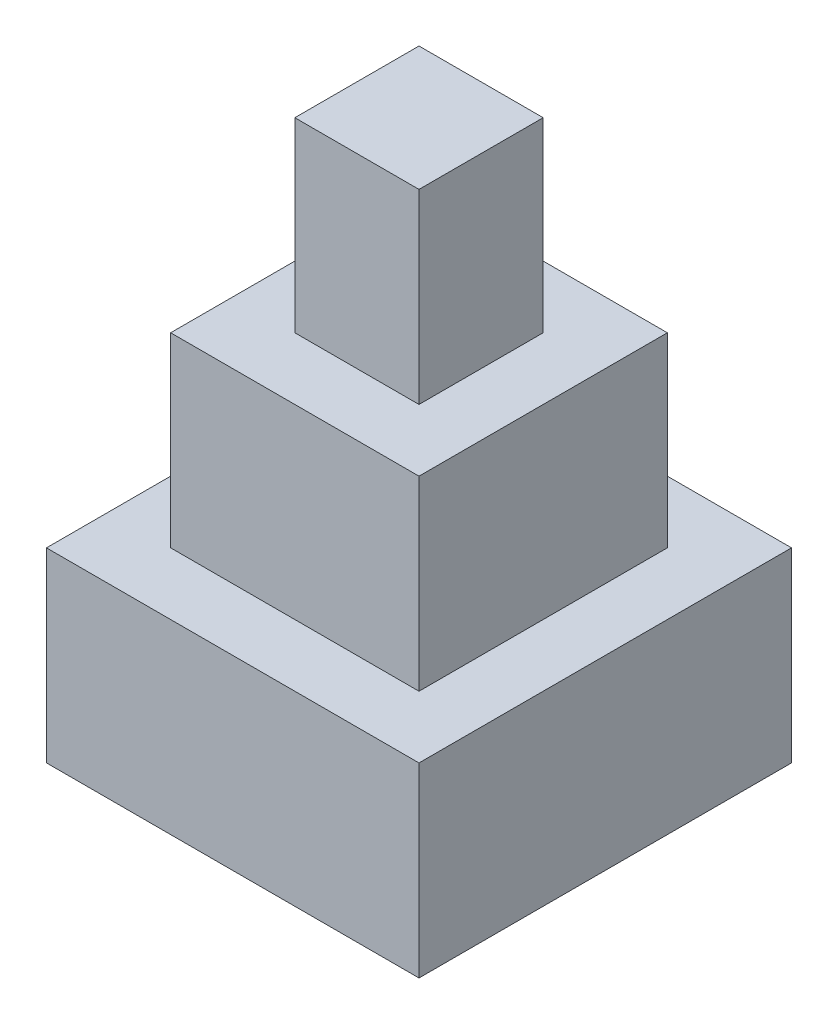
ISO-10303-21;
HEADER;
FILE_DESCRIPTION(('STEP AP214'),'2;1');
FILE_NAME('part.step','',(''),(''),'','','');
FILE_SCHEMA(('AUTOMOTIVE_DESIGN { 1 0 10303 214 1 1 1 1 }'));
ENDSEC;
DATA;
#1=APPLICATION_CONTEXT('core data for automotive mechanical design processes');
#2=APPLICATION_PROTOCOL_DEFINITION('international standard','automotive_design',2000,#1);
#3=PRODUCT_CONTEXT('',#1,'mechanical');
#4=PRODUCT('Part','Part','',(#3));
#5=PRODUCT_RELATED_PRODUCT_CATEGORY('part','',(#4));
#6=PRODUCT_DEFINITION_FORMATION('','',#4);
#7=PRODUCT_DEFINITION_CONTEXT('part definition',#1,'design');
#8=PRODUCT_DEFINITION('design','',#6,#7);
#9=PRODUCT_DEFINITION_SHAPE('','',#8);
#10=(LENGTH_UNIT() NAMED_UNIT(*) SI_UNIT(.MILLI.,.METRE.));
#11=(NAMED_UNIT(*) PLANE_ANGLE_UNIT() SI_UNIT($,.RADIAN.));
#12=(NAMED_UNIT(*) SI_UNIT($,.STERADIAN.) SOLID_ANGLE_UNIT());
#13=UNCERTAINTY_MEASURE_WITH_UNIT(LENGTH_MEASURE(1.E-05),#10,'distance_accuracy_value','');
#14=(GEOMETRIC_REPRESENTATION_CONTEXT(3) GLOBAL_UNCERTAINTY_ASSIGNED_CONTEXT((#13)) GLOBAL_UNIT_ASSIGNED_CONTEXT((#10,
#11,#12)) REPRESENTATION_CONTEXT('',''));
#15=CARTESIAN_POINT('',(0.,0.,0.));
#16=DIRECTION('',(0.,0.,1.));
#17=DIRECTION('',(1.,0.,0.));
#18=AXIS2_PLACEMENT_3D('',#15,#16,#17);
#19=CARTESIAN_POINT('',(0.,60.,0.));
#20=DIRECTION('',(0.,-1.,0.));
#21=DIRECTION('',(0.,0.,-1.));
#22=AXIS2_PLACEMENT_3D('',#19,#20,#21);
#23=PLANE('',#22);
#24=DIRECTION('',(0.,0.,-1.));
#25=VECTOR('',#24,1.);
#26=CARTESIAN_POINT('',(-5.40321500334897,60.,27.4638312123242));
#27=LINE('',#26,#25);
#28=CARTESIAN_POINT('',(-5.40321500334897,60.,27.4638312123242));
#29=VERTEX_POINT('',#28);
#30=CARTESIAN_POINT('',(-5.40321500334897,60.,-12.5361687876758));
#31=VERTEX_POINT('',#30);
#32=EDGE_CURVE('E152',#29,#31,#27,.T.);
#33=ORIENTED_EDGE('',*,*,#32,.T.);
#34=DIRECTION('',(-1.,0.,0.));
#35=VECTOR('',#34,1.);
#36=CARTESIAN_POINT('',(-45.403215003349,60.,-12.5361687876758));
#37=LINE('',#36,#35);
#38=CARTESIAN_POINT('',(-45.403215003349,60.,-12.5361687876758));
#39=VERTEX_POINT('',#38);
#40=EDGE_CURVE('E155',#31,#39,#37,.T.);
#41=ORIENTED_EDGE('',*,*,#40,.T.);
#42=DIRECTION('',(0.,0.,1.));
#43=VECTOR('',#42,1.);
#44=CARTESIAN_POINT('',(-45.403215003349,60.,27.4638312123242));
#45=LINE('',#44,#43);
#46=CARTESIAN_POINT('',(-45.403215003349,60.,27.4638312123242));
#47=VERTEX_POINT('',#46);
#48=EDGE_CURVE('E158',#39,#47,#45,.T.);
#49=ORIENTED_EDGE('',*,*,#48,.T.);
#50=DIRECTION('',(1.,0.,0.));
#51=VECTOR('',#50,1.);
#52=CARTESIAN_POINT('',(-45.403215003349,60.,27.4638312123242));
#53=LINE('',#52,#51);
#54=EDGE_CURVE('E160',#47,#29,#53,.T.);
#55=ORIENTED_EDGE('',*,*,#54,.T.);
#56=EDGE_LOOP('',(#33,#41,#49,#55));
#57=FACE_BOUND('',#56,.T.);
#58=DIRECTION('',(0.,0.,-1.));
#59=VECTOR('',#58,1.);
#60=CARTESIAN_POINT('',(-15.403215003349,60.,17.4638312123242));
#61=LINE('',#60,#59);
#62=CARTESIAN_POINT('',(-15.403215003349,60.,17.4638312123242));
#63=VERTEX_POINT('',#62);
#64=CARTESIAN_POINT('',(-15.403215003349,60.,-2.53616878767582));
#65=VERTEX_POINT('',#64);
#66=EDGE_CURVE('E50',#63,#65,#61,.T.);
#67=ORIENTED_EDGE('',*,*,#66,.F.);
#68=DIRECTION('',(1.,0.,0.));
#69=VECTOR('',#68,1.);
#70=CARTESIAN_POINT('',(-35.403215003349,60.,17.4638312123242));
#71=LINE('',#70,#69);
#72=CARTESIAN_POINT('',(-35.403215003349,60.,17.4638312123242));
#73=VERTEX_POINT('',#72);
#74=EDGE_CURVE('E54',#73,#63,#71,.T.);
#75=ORIENTED_EDGE('',*,*,#74,.F.);
#76=DIRECTION('',(0.,0.,1.));
#77=VECTOR('',#76,1.);
#78=CARTESIAN_POINT('',(-35.403215003349,60.,17.4638312123242));
#79=LINE('',#78,#77);
#80=CARTESIAN_POINT('',(-35.403215003349,60.,-2.53616878767582));
#81=VERTEX_POINT('',#80);
#82=EDGE_CURVE('E368',#81,#73,#79,.T.);
#83=ORIENTED_EDGE('',*,*,#82,.F.);
#84=DIRECTION('',(-1.,0.,0.));
#85=VECTOR('',#84,1.);
#86=CARTESIAN_POINT('',(-35.403215003349,60.,-2.53616878767582));
#87=LINE('',#86,#85);
#88=EDGE_CURVE('E374',#65,#81,#87,.T.);
#89=ORIENTED_EDGE('',*,*,#88,.F.);
#90=EDGE_LOOP('',(#67,#75,#83,#89));
#91=FACE_BOUND('',#90,.T.);
#92=ADVANCED_FACE('F33',(#57,#91),#23,.F.);
#93=CARTESIAN_POINT('',(-55.403215003349,30.,-22.5361687876758));
#94=DIRECTION('',(0.,0.,-1.));
#95=DIRECTION('',(-1.,0.,0.));
#96=AXIS2_PLACEMENT_3D('',#93,#94,#95);
#97=PLANE('',#96);
#98=DIRECTION('',(1.,0.,0.));
#99=VECTOR('',#98,1.);
#100=CARTESIAN_POINT('',(-55.403215003349,0.,-22.5361687876758));
#101=LINE('',#100,#99);
#102=CARTESIAN_POINT('',(-55.403215003349,0.,-22.5361687876758));
#103=VERTEX_POINT('',#102);
#104=CARTESIAN_POINT('',(4.59678499665103,0.,-22.5361687876758));
#105=VERTEX_POINT('',#104);
#106=EDGE_CURVE('E181',#103,#105,#101,.T.);
#107=ORIENTED_EDGE('',*,*,#106,.F.);
#108=DIRECTION('',(0.,-1.,0.));
#109=VECTOR('',#108,1.);
#110=CARTESIAN_POINT('',(-55.403215003349,30.,-22.5361687876758));
#111=LINE('',#110,#109);
#112=CARTESIAN_POINT('',(-55.403215003349,30.,-22.5361687876758));
#113=VERTEX_POINT('',#112);
#114=EDGE_CURVE('E11',#113,#103,#111,.T.);
#115=ORIENTED_EDGE('',*,*,#114,.F.);
#116=DIRECTION('',(1.,0.,0.));
#117=VECTOR('',#116,1.);
#118=CARTESIAN_POINT('',(-55.403215003349,30.,-22.5361687876758));
#119=LINE('',#118,#117);
#120=CARTESIAN_POINT('',(4.59678499665103,30.,-22.5361687876758));
#121=VERTEX_POINT('',#120);
#122=EDGE_CURVE('E182',#113,#121,#119,.T.);
#123=ORIENTED_EDGE('',*,*,#122,.T.);
#124=DIRECTION('',(0.,-1.,0.));
#125=VECTOR('',#124,1.);
#126=CARTESIAN_POINT('',(4.59678499665103,30.,-22.5361687876758));
#127=LINE('',#126,#125);
#128=EDGE_CURVE('E37',#121,#105,#127,.T.);
#129=ORIENTED_EDGE('',*,*,#128,.T.);
#130=EDGE_LOOP('',(#107,#115,#123,#129));
#131=FACE_BOUND('',#130,.T.);
#132=ADVANCED_FACE('F35',(#131),#97,.T.);
#133=CARTESIAN_POINT('',(-55.403215003349,30.,37.4638312123242));
#134=DIRECTION('',(-1.,0.,0.));
#135=DIRECTION('',(0.,0.,1.));
#136=AXIS2_PLACEMENT_3D('',#133,#134,#135);
#137=PLANE('',#136);
#138=DIRECTION('',(0.,0.,-1.));
#139=VECTOR('',#138,1.);
#140=CARTESIAN_POINT('',(-55.403215003349,0.,37.4638312123242));
#141=LINE('',#140,#139);
#142=CARTESIAN_POINT('',(-55.403215003349,0.,37.4638312123242));
#143=VERTEX_POINT('',#142);
#144=EDGE_CURVE('E186',#143,#103,#141,.T.);
#145=ORIENTED_EDGE('',*,*,#144,.F.);
#146=DIRECTION('',(0.,-1.,0.));
#147=VECTOR('',#146,1.);
#148=CARTESIAN_POINT('',(-55.403215003349,30.,37.4638312123242));
#149=LINE('',#148,#147);
#150=CARTESIAN_POINT('',(-55.403215003349,30.,37.4638312123242));
#151=VERTEX_POINT('',#150);
#152=EDGE_CURVE('E42',#151,#143,#149,.T.);
#153=ORIENTED_EDGE('',*,*,#152,.F.);
#154=DIRECTION('',(0.,0.,-1.));
#155=VECTOR('',#154,1.);
#156=CARTESIAN_POINT('',(-55.403215003349,30.,37.4638312123242));
#157=LINE('',#156,#155);
#158=EDGE_CURVE('E190',#151,#113,#157,.T.);
#159=ORIENTED_EDGE('',*,*,#158,.T.);
#160=ORIENTED_EDGE('',*,*,#114,.T.);
#161=EDGE_LOOP('',(#145,#153,#159,#160));
#162=FACE_BOUND('',#161,.T.);
#163=ADVANCED_FACE('F218',(#162),#137,.T.);
#164=CARTESIAN_POINT('',(-55.403215003349,30.,37.4638312123242));
#165=DIRECTION('',(0.,0.,-1.));
#166=DIRECTION('',(-1.,0.,0.));
#167=AXIS2_PLACEMENT_3D('',#164,#165,#166);
#168=PLANE('',#167);
#169=DIRECTION('',(1.,0.,0.));
#170=VECTOR('',#169,1.);
#171=CARTESIAN_POINT('',(-55.403215003349,0.,37.4638312123242));
#172=LINE('',#171,#170);
#173=CARTESIAN_POINT('',(4.59678499665103,0.,37.4638312123242));
#174=VERTEX_POINT('',#173);
#175=EDGE_CURVE('E198',#143,#174,#172,.T.);
#176=ORIENTED_EDGE('',*,*,#175,.T.);
#177=DIRECTION('',(0.,-1.,0.));
#178=VECTOR('',#177,1.);
#179=CARTESIAN_POINT('',(4.59678499665103,30.,37.4638312123242));
#180=LINE('',#179,#178);
#181=CARTESIAN_POINT('',(4.59678499665103,30.,37.4638312123242));
#182=VERTEX_POINT('',#181);
#183=EDGE_CURVE('E202',#182,#174,#180,.T.);
#184=ORIENTED_EDGE('',*,*,#183,.F.);
#185=DIRECTION('',(1.,0.,0.));
#186=VECTOR('',#185,1.);
#187=CARTESIAN_POINT('',(-55.403215003349,30.,37.4638312123242));
#188=LINE('',#187,#186);
#189=EDGE_CURVE('E188',#151,#182,#188,.T.);
#190=ORIENTED_EDGE('',*,*,#189,.F.);
#191=ORIENTED_EDGE('',*,*,#152,.T.);
#192=EDGE_LOOP('',(#176,#184,#190,#191));
#193=FACE_BOUND('',#192,.T.);
#194=ADVANCED_FACE('F224',(#193),#168,.F.);
#195=CARTESIAN_POINT('',(4.59678499665103,30.,37.4638312123242));
#196=DIRECTION('',(-1.,0.,0.));
#197=DIRECTION('',(0.,0.,1.));
#198=AXIS2_PLACEMENT_3D('',#195,#196,#197);
#199=PLANE('',#198);
#200=DIRECTION('',(0.,0.,-1.));
#201=VECTOR('',#200,1.);
#202=CARTESIAN_POINT('',(4.59678499665103,0.,37.4638312123242));
#203=LINE('',#202,#201);
#204=EDGE_CURVE('E195',#174,#105,#203,.T.);
#205=ORIENTED_EDGE('',*,*,#204,.T.);
#206=ORIENTED_EDGE('',*,*,#128,.F.);
#207=DIRECTION('',(0.,0.,-1.));
#208=VECTOR('',#207,1.);
#209=CARTESIAN_POINT('',(4.59678499665103,30.,37.4638312123242));
#210=LINE('',#209,#208);
#211=EDGE_CURVE('E185',#182,#121,#210,.T.);
#212=ORIENTED_EDGE('',*,*,#211,.F.);
#213=ORIENTED_EDGE('',*,*,#183,.T.);
#214=EDGE_LOOP('',(#205,#206,#212,#213));
#215=FACE_BOUND('',#214,.T.);
#216=ADVANCED_FACE('F212',(#215),#199,.F.);
#217=CARTESIAN_POINT('',(0.,30.,0.));
#218=DIRECTION('',(0.,1.,0.));
#219=DIRECTION('',(0.,0.,1.));
#220=AXIS2_PLACEMENT_3D('',#217,#218,#219);
#221=PLANE('',#220);
#222=DIRECTION('',(0.,0.,-1.));
#223=VECTOR('',#222,1.);
#224=CARTESIAN_POINT('',(-5.40321500334897,30.,27.4638312123242));
#225=LINE('',#224,#223);
#226=CARTESIAN_POINT('',(-5.40321500334897,30.,27.4638312123242));
#227=VERTEX_POINT('',#226);
#228=CARTESIAN_POINT('',(-5.40321500334897,30.,-12.5361687876758));
#229=VERTEX_POINT('',#228);
#230=EDGE_CURVE('E143',#227,#229,#225,.T.);
#231=ORIENTED_EDGE('',*,*,#230,.F.);
#232=DIRECTION('',(1.,0.,0.));
#233=VECTOR('',#232,1.);
#234=CARTESIAN_POINT('',(-45.403215003349,30.,27.4638312123242));
#235=LINE('',#234,#233);
#236=CARTESIAN_POINT('',(-45.403215003349,30.,27.4638312123242));
#237=VERTEX_POINT('',#236);
#238=EDGE_CURVE('E156',#237,#227,#235,.T.);
#239=ORIENTED_EDGE('',*,*,#238,.F.);
#240=DIRECTION('',(0.,0.,1.));
#241=VECTOR('',#240,1.);
#242=CARTESIAN_POINT('',(-45.403215003349,30.,27.4638312123242));
#243=LINE('',#242,#241);
#244=CARTESIAN_POINT('',(-45.403215003349,30.,-12.5361687876758));
#245=VERTEX_POINT('',#244);
#246=EDGE_CURVE('E165',#245,#237,#243,.T.);
#247=ORIENTED_EDGE('',*,*,#246,.F.);
#248=DIRECTION('',(-1.,0.,0.));
#249=VECTOR('',#248,1.);
#250=CARTESIAN_POINT('',(-45.403215003349,30.,-12.5361687876758));
#251=LINE('',#250,#249);
#252=EDGE_CURVE('E146',#229,#245,#251,.T.);
#253=ORIENTED_EDGE('',*,*,#252,.F.);
#254=EDGE_LOOP('',(#231,#239,#247,#253));
#255=FACE_BOUND('',#254,.T.);
#256=ORIENTED_EDGE('',*,*,#122,.F.);
#257=ORIENTED_EDGE('',*,*,#158,.F.);
#258=ORIENTED_EDGE('',*,*,#189,.T.);
#259=ORIENTED_EDGE('',*,*,#211,.T.);
#260=EDGE_LOOP('',(#256,#257,#258,#259));
#261=FACE_BOUND('',#260,.T.);
#262=ADVANCED_FACE('F222',(#255,#261),#221,.T.);
#263=CARTESIAN_POINT('',(0.,0.,0.));
#264=DIRECTION('',(0.,1.,0.));
#265=DIRECTION('',(0.,0.,1.));
#266=AXIS2_PLACEMENT_3D('',#263,#264,#265);
#267=PLANE('',#266);
#268=ORIENTED_EDGE('',*,*,#106,.T.);
#269=ORIENTED_EDGE('',*,*,#204,.F.);
#270=ORIENTED_EDGE('',*,*,#175,.F.);
#271=ORIENTED_EDGE('',*,*,#144,.T.);
#272=EDGE_LOOP('',(#268,#269,#270,#271));
#273=FACE_BOUND('',#272,.T.);
#274=ADVANCED_FACE('F215',(#273),#267,.F.);
#275=CARTESIAN_POINT('',(-5.40321500334897,60.,27.4638312123242));
#276=DIRECTION('',(-1.,0.,0.));
#277=DIRECTION('',(0.,0.,1.));
#278=AXIS2_PLACEMENT_3D('',#275,#276,#277);
#279=PLANE('',#278);
#280=ORIENTED_EDGE('',*,*,#230,.T.);
#281=DIRECTION('',(0.,-1.,0.));
#282=VECTOR('',#281,1.);
#283=CARTESIAN_POINT('',(-5.40321500334897,60.,-12.5361687876758));
#284=LINE('',#283,#282);
#285=EDGE_CURVE('E178',#31,#229,#284,.T.);
#286=ORIENTED_EDGE('',*,*,#285,.F.);
#287=ORIENTED_EDGE('',*,*,#32,.F.);
#288=DIRECTION('',(0.,-1.,0.));
#289=VECTOR('',#288,1.);
#290=CARTESIAN_POINT('',(-5.40321500334897,60.,27.4638312123242));
#291=LINE('',#290,#289);
#292=EDGE_CURVE('E161',#29,#227,#291,.T.);
#293=ORIENTED_EDGE('',*,*,#292,.T.);
#294=EDGE_LOOP('',(#280,#286,#287,#293));
#295=FACE_BOUND('',#294,.T.);
#296=ADVANCED_FACE('F252',(#295),#279,.F.);
#297=CARTESIAN_POINT('',(-45.403215003349,60.,-12.5361687876758));
#298=DIRECTION('',(0.,0.,1.));
#299=DIRECTION('',(1.,0.,0.));
#300=AXIS2_PLACEMENT_3D('',#297,#298,#299);
#301=PLANE('',#300);
#302=ORIENTED_EDGE('',*,*,#252,.T.);
#303=DIRECTION('',(0.,-1.,0.));
#304=VECTOR('',#303,1.);
#305=CARTESIAN_POINT('',(-45.403215003349,60.,-12.5361687876758));
#306=LINE('',#305,#304);
#307=EDGE_CURVE('E175',#39,#245,#306,.T.);
#308=ORIENTED_EDGE('',*,*,#307,.F.);
#309=ORIENTED_EDGE('',*,*,#40,.F.);
#310=ORIENTED_EDGE('',*,*,#285,.T.);
#311=EDGE_LOOP('',(#302,#308,#309,#310));
#312=FACE_BOUND('',#311,.T.);
#313=ADVANCED_FACE('F248',(#312),#301,.F.);
#314=CARTESIAN_POINT('',(-45.403215003349,60.,27.4638312123242));
#315=DIRECTION('',(1.,0.,0.));
#316=DIRECTION('',(0.,0.,-1.));
#317=AXIS2_PLACEMENT_3D('',#314,#315,#316);
#318=PLANE('',#317);
#319=ORIENTED_EDGE('',*,*,#246,.T.);
#320=DIRECTION('',(0.,-1.,0.));
#321=VECTOR('',#320,1.);
#322=CARTESIAN_POINT('',(-45.403215003349,60.,27.4638312123242));
#323=LINE('',#322,#321);
#324=EDGE_CURVE('E172',#47,#237,#323,.T.);
#325=ORIENTED_EDGE('',*,*,#324,.F.);
#326=ORIENTED_EDGE('',*,*,#48,.F.);
#327=ORIENTED_EDGE('',*,*,#307,.T.);
#328=EDGE_LOOP('',(#319,#325,#326,#327));
#329=FACE_BOUND('',#328,.T.);
#330=ADVANCED_FACE('F244',(#329),#318,.F.);
#331=CARTESIAN_POINT('',(-45.403215003349,60.,27.4638312123242));
#332=DIRECTION('',(0.,0.,-1.));
#333=DIRECTION('',(-1.,0.,0.));
#334=AXIS2_PLACEMENT_3D('',#331,#332,#333);
#335=PLANE('',#334);
#336=ORIENTED_EDGE('',*,*,#238,.T.);
#337=ORIENTED_EDGE('',*,*,#292,.F.);
#338=ORIENTED_EDGE('',*,*,#54,.F.);
#339=ORIENTED_EDGE('',*,*,#324,.T.);
#340=EDGE_LOOP('',(#336,#337,#338,#339));
#341=FACE_BOUND('',#340,.T.);
#342=ADVANCED_FACE('F241',(#341),#335,.F.);
#343=CARTESIAN_POINT('',(-15.403215003349,90.,17.4638312123242));
#344=DIRECTION('',(-1.,0.,0.));
#345=DIRECTION('',(0.,0.,1.));
#346=AXIS2_PLACEMENT_3D('',#343,#344,#345);
#347=PLANE('',#346);
#348=ORIENTED_EDGE('',*,*,#66,.T.);
#349=DIRECTION('',(0.,-1.,0.));
#350=VECTOR('',#349,1.);
#351=CARTESIAN_POINT('',(-15.403215003349,90.,-2.53616878767582));
#352=LINE('',#351,#350);
#353=CARTESIAN_POINT('',(-15.403215003349,90.,-2.53616878767582));
#354=VERTEX_POINT('',#353);
#355=EDGE_CURVE('E126',#354,#65,#352,.T.);
#356=ORIENTED_EDGE('',*,*,#355,.F.);
#357=DIRECTION('',(0.,0.,-1.));
#358=VECTOR('',#357,1.);
#359=CARTESIAN_POINT('',(-15.403215003349,90.,17.4638312123242));
#360=LINE('',#359,#358);
#361=CARTESIAN_POINT('',(-15.403215003349,90.,17.4638312123242));
#362=VERTEX_POINT('',#361);
#363=EDGE_CURVE('E132',#362,#354,#360,.T.);
#364=ORIENTED_EDGE('',*,*,#363,.F.);
#365=DIRECTION('',(0.,-1.,0.));
#366=VECTOR('',#365,1.);
#367=CARTESIAN_POINT('',(-15.403215003349,90.,17.4638312123242));
#368=LINE('',#367,#366);
#369=EDGE_CURVE('E366',#362,#63,#368,.T.);
#370=ORIENTED_EDGE('',*,*,#369,.T.);
#371=EDGE_LOOP('',(#348,#356,#364,#370));
#372=FACE_BOUND('',#371,.T.);
#373=ADVANCED_FACE('F142',(#372),#347,.F.);
#374=CARTESIAN_POINT('',(-35.403215003349,90.,-2.53616878767582));
#375=DIRECTION('',(0.,0.,1.));
#376=DIRECTION('',(1.,0.,0.));
#377=AXIS2_PLACEMENT_3D('',#374,#375,#376);
#378=PLANE('',#377);
#379=ORIENTED_EDGE('',*,*,#88,.T.);
#380=DIRECTION('',(0.,-1.,0.));
#381=VECTOR('',#380,1.);
#382=CARTESIAN_POINT('',(-35.403215003349,90.,-2.53616878767582));
#383=LINE('',#382,#381);
#384=CARTESIAN_POINT('',(-35.403215003349,90.,-2.53616878767582));
#385=VERTEX_POINT('',#384);
#386=EDGE_CURVE('E128',#385,#81,#383,.T.);
#387=ORIENTED_EDGE('',*,*,#386,.F.);
#388=DIRECTION('',(-1.,0.,0.));
#389=VECTOR('',#388,1.);
#390=CARTESIAN_POINT('',(-35.403215003349,90.,-2.53616878767582));
#391=LINE('',#390,#389);
#392=EDGE_CURVE('E121',#354,#385,#391,.T.);
#393=ORIENTED_EDGE('',*,*,#392,.F.);
#394=ORIENTED_EDGE('',*,*,#355,.T.);
#395=EDGE_LOOP('',(#379,#387,#393,#394));
#396=FACE_BOUND('',#395,.T.);
#397=ADVANCED_FACE('F124',(#396),#378,.F.);
#398=CARTESIAN_POINT('',(-35.403215003349,90.,17.4638312123242));
#399=DIRECTION('',(1.,0.,0.));
#400=DIRECTION('',(0.,0.,-1.));
#401=AXIS2_PLACEMENT_3D('',#398,#399,#400);
#402=PLANE('',#401);
#403=ORIENTED_EDGE('',*,*,#82,.T.);
#404=DIRECTION('',(0.,-1.,0.));
#405=VECTOR('',#404,1.);
#406=CARTESIAN_POINT('',(-35.403215003349,90.,17.4638312123242));
#407=LINE('',#406,#405);
#408=CARTESIAN_POINT('',(-35.403215003349,90.,17.4638312123242));
#409=VERTEX_POINT('',#408);
#410=EDGE_CURVE('E148',#409,#73,#407,.T.);
#411=ORIENTED_EDGE('',*,*,#410,.F.);
#412=DIRECTION('',(0.,0.,1.));
#413=VECTOR('',#412,1.);
#414=CARTESIAN_POINT('',(-35.403215003349,90.,17.4638312123242));
#415=LINE('',#414,#413);
#416=EDGE_CURVE('E131',#385,#409,#415,.T.);
#417=ORIENTED_EDGE('',*,*,#416,.F.);
#418=ORIENTED_EDGE('',*,*,#386,.T.);
#419=EDGE_LOOP('',(#403,#411,#417,#418));
#420=FACE_BOUND('',#419,.T.);
#421=ADVANCED_FACE('F293',(#420),#402,.F.);
#422=CARTESIAN_POINT('',(-35.403215003349,90.,17.4638312123242));
#423=DIRECTION('',(0.,0.,-1.));
#424=DIRECTION('',(-1.,0.,0.));
#425=AXIS2_PLACEMENT_3D('',#422,#423,#424);
#426=PLANE('',#425);
#427=ORIENTED_EDGE('',*,*,#74,.T.);
#428=ORIENTED_EDGE('',*,*,#369,.F.);
#429=DIRECTION('',(1.,0.,0.));
#430=VECTOR('',#429,1.);
#431=CARTESIAN_POINT('',(-35.403215003349,90.,17.4638312123242));
#432=LINE('',#431,#430);
#433=EDGE_CURVE('E137',#409,#362,#432,.T.);
#434=ORIENTED_EDGE('',*,*,#433,.F.);
#435=ORIENTED_EDGE('',*,*,#410,.T.);
#436=EDGE_LOOP('',(#427,#428,#434,#435));
#437=FACE_BOUND('',#436,.T.);
#438=ADVANCED_FACE('F299',(#437),#426,.F.);
#439=CARTESIAN_POINT('',(0.,90.,0.));
#440=DIRECTION('',(0.,-1.,0.));
#441=DIRECTION('',(0.,0.,-1.));
#442=AXIS2_PLACEMENT_3D('',#439,#440,#441);
#443=PLANE('',#442);
#444=ORIENTED_EDGE('',*,*,#363,.T.);
#445=ORIENTED_EDGE('',*,*,#392,.T.);
#446=ORIENTED_EDGE('',*,*,#416,.T.);
#447=ORIENTED_EDGE('',*,*,#433,.T.);
#448=EDGE_LOOP('',(#444,#445,#446,#447));
#449=FACE_BOUND('',#448,.T.);
#450=ADVANCED_FACE('F135',(#449),#443,.F.);
#451=CLOSED_SHELL('',(#92,#132,#163,#194,#216,#262,#274,#296,#313,#330,#342,#373,#397,#421,#438,#450));
#452=MANIFOLD_SOLID_BREP('B2',#451);
#453=ADVANCED_BREP_SHAPE_REPRESENTATION('',(#18,#452),#14);
#454=SHAPE_DEFINITION_REPRESENTATION(#9,#453);
ENDSEC;
END-ISO-10303-21;
